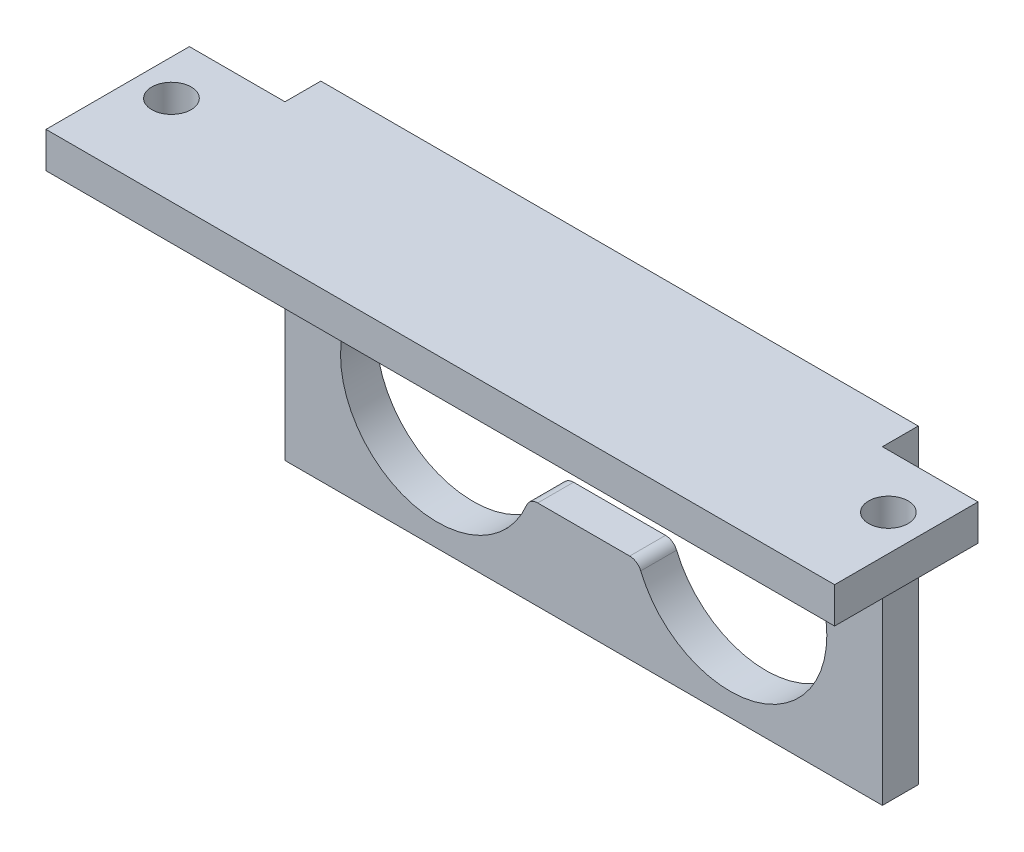
ISO-10303-21;
HEADER;
FILE_DESCRIPTION(('STEP AP214'),'2;1');
FILE_NAME('part.step','',(''),(''),'','','');
FILE_SCHEMA(('AUTOMOTIVE_DESIGN { 1 0 10303 214 1 1 1 1 }'));
ENDSEC;
DATA;
#1=APPLICATION_CONTEXT('core data for automotive mechanical design processes');
#2=APPLICATION_PROTOCOL_DEFINITION('international standard','automotive_design',2000,#1);
#3=PRODUCT_CONTEXT('',#1,'mechanical');
#4=PRODUCT('Part','Part','',(#3));
#5=PRODUCT_RELATED_PRODUCT_CATEGORY('part','',(#4));
#6=PRODUCT_DEFINITION_FORMATION('','',#4);
#7=PRODUCT_DEFINITION_CONTEXT('part definition',#1,'design');
#8=PRODUCT_DEFINITION('design','',#6,#7);
#9=PRODUCT_DEFINITION_SHAPE('','',#8);
#10=(LENGTH_UNIT() NAMED_UNIT(*) SI_UNIT(.MILLI.,.METRE.));
#11=(NAMED_UNIT(*) PLANE_ANGLE_UNIT() SI_UNIT($,.RADIAN.));
#12=(NAMED_UNIT(*) SI_UNIT($,.STERADIAN.) SOLID_ANGLE_UNIT());
#13=UNCERTAINTY_MEASURE_WITH_UNIT(LENGTH_MEASURE(1.E-05),#10,'distance_accuracy_value','');
#14=(GEOMETRIC_REPRESENTATION_CONTEXT(3) GLOBAL_UNCERTAINTY_ASSIGNED_CONTEXT((#13)) GLOBAL_UNIT_ASSIGNED_CONTEXT((#10,
#11,#12)) REPRESENTATION_CONTEXT('',''));
#15=CARTESIAN_POINT('',(0.,0.,0.));
#16=DIRECTION('',(0.,0.,1.));
#17=DIRECTION('',(1.,0.,0.));
#18=AXIS2_PLACEMENT_3D('',#15,#16,#17);
#19=CARTESIAN_POINT('',(25.,-10.,3.));
#20=DIRECTION('',(-1.,0.,0.));
#21=DIRECTION('',(0.,0.,1.));
#22=AXIS2_PLACEMENT_3D('',#19,#20,#21);
#23=PLANE('',#22);
#24=DIRECTION('',(0.,1.,0.));
#25=VECTOR('',#24,1.);
#26=CARTESIAN_POINT('',(25.,13.,3.));
#27=LINE('',#26,#25);
#28=CARTESIAN_POINT('',(25.,13.,3.));
#29=VERTEX_POINT('',#28);
#30=CARTESIAN_POINT('',(25.,16.,3.));
#31=VERTEX_POINT('',#30);
#32=EDGE_CURVE('E217',#29,#31,#27,.T.);
#33=ORIENTED_EDGE('',*,*,#32,.F.);
#34=DIRECTION('',(0.,1.,0.));
#35=VECTOR('',#34,1.);
#36=CARTESIAN_POINT('',(25.,-10.,3.));
#37=LINE('',#36,#35);
#38=CARTESIAN_POINT('',(25.,-10.,3.));
#39=VERTEX_POINT('',#38);
#40=EDGE_CURVE('E211',#39,#29,#37,.T.);
#41=ORIENTED_EDGE('',*,*,#40,.F.);
#42=DIRECTION('',(0.,0.,-1.));
#43=VECTOR('',#42,1.);
#44=CARTESIAN_POINT('',(25.,-10.,3.));
#45=LINE('',#44,#43);
#46=CARTESIAN_POINT('',(25.,-10.,0.));
#47=VERTEX_POINT('',#46);
#48=EDGE_CURVE('E43',#39,#47,#45,.T.);
#49=ORIENTED_EDGE('',*,*,#48,.T.);
#50=DIRECTION('',(0.,1.,0.));
#51=VECTOR('',#50,1.);
#52=CARTESIAN_POINT('',(25.,-10.,0.));
#53=LINE('',#52,#51);
#54=CARTESIAN_POINT('',(25.,16.,0.));
#55=VERTEX_POINT('',#54);
#56=EDGE_CURVE('E205',#47,#55,#53,.T.);
#57=ORIENTED_EDGE('',*,*,#56,.T.);
#58=DIRECTION('',(0.,0.,-1.));
#59=VECTOR('',#58,1.);
#60=CARTESIAN_POINT('',(25.,16.,0.));
#61=LINE('',#60,#59);
#62=EDGE_CURVE('E222',#31,#55,#61,.T.);
#63=ORIENTED_EDGE('',*,*,#62,.F.);
#64=EDGE_LOOP('',(#33,#41,#49,#57,#63));
#65=FACE_BOUND('',#64,.T.);
#66=ADVANCED_FACE('F35',(#65),#23,.F.);
#67=CARTESIAN_POINT('',(-25.,16.,15.));
#68=DIRECTION('',(0.,0.,-1.));
#69=DIRECTION('',(-1.,0.,0.));
#70=AXIS2_PLACEMENT_3D('',#67,#68,#69);
#71=PLANE('',#70);
#72=DIRECTION('',(-1.,0.,0.));
#73=VECTOR('',#72,1.);
#74=CARTESIAN_POINT('',(25.,13.,15.));
#75=LINE('',#74,#73);
#76=CARTESIAN_POINT('',(33.,13.,15.));
#77=VERTEX_POINT('',#76);
#78=CARTESIAN_POINT('',(-33.,13.,15.));
#79=VERTEX_POINT('',#78);
#80=EDGE_CURVE('E213',#77,#79,#75,.T.);
#81=ORIENTED_EDGE('',*,*,#80,.F.);
#82=DIRECTION('',(0.,1.,0.));
#83=VECTOR('',#82,1.);
#84=CARTESIAN_POINT('',(33.,13.,15.));
#85=LINE('',#84,#83);
#86=CARTESIAN_POINT('',(33.,16.,15.));
#87=VERTEX_POINT('',#86);
#88=EDGE_CURVE('E344',#77,#87,#85,.T.);
#89=ORIENTED_EDGE('',*,*,#88,.T.);
#90=DIRECTION('',(1.,0.,0.));
#91=VECTOR('',#90,1.);
#92=CARTESIAN_POINT('',(-25.,16.,15.));
#93=LINE('',#92,#91);
#94=CARTESIAN_POINT('',(-33.,16.,15.));
#95=VERTEX_POINT('',#94);
#96=EDGE_CURVE('E215',#95,#87,#93,.T.);
#97=ORIENTED_EDGE('',*,*,#96,.F.);
#98=DIRECTION('',(0.,1.,0.));
#99=VECTOR('',#98,1.);
#100=CARTESIAN_POINT('',(-33.,13.,15.));
#101=LINE('',#100,#99);
#102=EDGE_CURVE('E364',#79,#95,#101,.T.);
#103=ORIENTED_EDGE('',*,*,#102,.F.);
#104=EDGE_LOOP('',(#81,#89,#97,#103));
#105=FACE_BOUND('',#104,.T.);
#106=ADVANCED_FACE('F399',(#105),#71,.F.);
#107=CARTESIAN_POINT('',(0.,0.,3.));
#108=DIRECTION('',(0.,0.,1.));
#109=DIRECTION('',(1.,0.,0.));
#110=AXIS2_PLACEMENT_3D('',#107,#108,#109);
#111=PLANE('',#110);
#112=DIRECTION('',(0.,-1.,0.));
#113=VECTOR('',#112,1.);
#114=CARTESIAN_POINT('',(-25.,-10.,3.));
#115=LINE('',#114,#113);
#116=CARTESIAN_POINT('',(-25.,13.,3.));
#117=VERTEX_POINT('',#116);
#118=CARTESIAN_POINT('',(-25.,-10.,3.));
#119=VERTEX_POINT('',#118);
#120=EDGE_CURVE('E201',#117,#119,#115,.T.);
#121=ORIENTED_EDGE('',*,*,#120,.T.);
#122=DIRECTION('',(1.,0.,0.));
#123=VECTOR('',#122,1.);
#124=CARTESIAN_POINT('',(25.,-10.,3.));
#125=LINE('',#124,#123);
#126=EDGE_CURVE('E204',#119,#39,#125,.T.);
#127=ORIENTED_EDGE('',*,*,#126,.T.);
#128=ORIENTED_EDGE('',*,*,#40,.T.);
#129=DIRECTION('',(1.,0.,0.));
#130=VECTOR('',#129,1.);
#131=CARTESIAN_POINT('',(25.,13.,3.));
#132=LINE('',#131,#130);
#133=EDGE_CURVE('E194',#117,#29,#132,.T.);
#134=ORIENTED_EDGE('',*,*,#133,.F.);
#135=EDGE_LOOP('',(#121,#127,#128,#134));
#136=FACE_BOUND('',#135,.T.);
#137=CARTESIAN_POINT('',(12.25,0.,3.));
#138=DIRECTION('',(0.,0.,1.));
#139=DIRECTION('',(1.,0.,0.));
#140=AXIS2_PLACEMENT_3D('',#137,#138,#139);
#141=CIRCLE('',#140,8.1);
#142=CARTESIAN_POINT('',(4.77307692307692,-3.11538461538461,3.));
#143=VERTEX_POINT('',#142);
#144=CARTESIAN_POINT('',(4.77307692307692,3.11538461538462,3.));
#145=VERTEX_POINT('',#144);
#146=EDGE_CURVE('E259',#143,#145,#141,.T.);
#147=ORIENTED_EDGE('',*,*,#146,.F.);
#148=CARTESIAN_POINT('',(3.85,-3.5,3.));
#149=DIRECTION('',(0.,0.,-1.));
#150=DIRECTION('',(-1.,0.,0.));
#151=AXIS2_PLACEMENT_3D('',#148,#149,#150);
#152=CIRCLE('',#151,1.);
#153=CARTESIAN_POINT('',(3.85,-2.5,3.));
#154=VERTEX_POINT('',#153);
#155=EDGE_CURVE('E257',#154,#143,#152,.T.);
#156=ORIENTED_EDGE('',*,*,#155,.F.);
#157=DIRECTION('',(1.,0.,0.));
#158=VECTOR('',#157,1.);
#159=CARTESIAN_POINT('',(3.85,-2.5,3.));
#160=LINE('',#159,#158);
#161=CARTESIAN_POINT('',(-3.85,-2.5,3.));
#162=VERTEX_POINT('',#161);
#163=EDGE_CURVE('E273',#162,#154,#160,.T.);
#164=ORIENTED_EDGE('',*,*,#163,.F.);
#165=CARTESIAN_POINT('',(-3.85,-3.5,3.));
#166=DIRECTION('',(0.,0.,-1.));
#167=DIRECTION('',(1.,0.,0.));
#168=AXIS2_PLACEMENT_3D('',#165,#166,#167);
#169=CIRCLE('',#168,1.);
#170=CARTESIAN_POINT('',(-4.77307692307692,-3.11538461538462,3.));
#171=VERTEX_POINT('',#170);
#172=EDGE_CURVE('E270',#171,#162,#169,.T.);
#173=ORIENTED_EDGE('',*,*,#172,.F.);
#174=CARTESIAN_POINT('',(-12.25,0.,3.));
#175=DIRECTION('',(0.,0.,1.));
#176=DIRECTION('',(1.,0.,0.));
#177=AXIS2_PLACEMENT_3D('',#174,#175,#176);
#178=CIRCLE('',#177,8.1);
#179=CARTESIAN_POINT('',(-4.77307692307692,3.11538461538461,3.));
#180=VERTEX_POINT('',#179);
#181=EDGE_CURVE('E268',#180,#171,#178,.T.);
#182=ORIENTED_EDGE('',*,*,#181,.F.);
#183=CARTESIAN_POINT('',(-3.85,3.5,3.));
#184=DIRECTION('',(0.,0.,-1.));
#185=DIRECTION('',(-1.,0.,0.));
#186=AXIS2_PLACEMENT_3D('',#183,#184,#185);
#187=CIRCLE('',#186,1.);
#188=CARTESIAN_POINT('',(-3.85,2.5,3.));
#189=VERTEX_POINT('',#188);
#190=EDGE_CURVE('E266',#189,#180,#187,.T.);
#191=ORIENTED_EDGE('',*,*,#190,.F.);
#192=DIRECTION('',(-1.,0.,0.));
#193=VECTOR('',#192,1.);
#194=CARTESIAN_POINT('',(-3.85,2.5,3.));
#195=LINE('',#194,#193);
#196=CARTESIAN_POINT('',(3.85,2.5,3.));
#197=VERTEX_POINT('',#196);
#198=EDGE_CURVE('E264',#197,#189,#195,.T.);
#199=ORIENTED_EDGE('',*,*,#198,.F.);
#200=CARTESIAN_POINT('',(3.85,3.5,3.));
#201=DIRECTION('',(0.,0.,-1.));
#202=DIRECTION('',(1.,0.,0.));
#203=AXIS2_PLACEMENT_3D('',#200,#201,#202);
#204=CIRCLE('',#203,1.);
#205=EDGE_CURVE('E262',#145,#197,#204,.T.);
#206=ORIENTED_EDGE('',*,*,#205,.F.);
#207=EDGE_LOOP('',(#147,#156,#164,#173,#182,#191,#199,#206));
#208=FACE_BOUND('',#207,.T.);
#209=DIRECTION('',(-1.,0.,0.));
#210=VECTOR('',#209,1.);
#211=CARTESIAN_POINT('',(3.25,9.,3.));
#212=LINE('',#211,#210);
#213=CARTESIAN_POINT('',(3.25,9.,3.));
#214=VERTEX_POINT('',#213);
#215=CARTESIAN_POINT('',(-3.25,9.,3.));
#216=VERTEX_POINT('',#215);
#217=EDGE_CURVE('E230',#214,#216,#212,.T.);
#218=ORIENTED_EDGE('',*,*,#217,.F.);
#219=CARTESIAN_POINT('',(3.25,7.25,3.));
#220=DIRECTION('',(0.,0.,1.));
#221=DIRECTION('',(1.,0.,0.));
#222=AXIS2_PLACEMENT_3D('',#219,#220,#221);
#223=CIRCLE('',#222,1.75);
#224=CARTESIAN_POINT('',(3.25,5.5,3.));
#225=VERTEX_POINT('',#224);
#226=EDGE_CURVE('E228',#225,#214,#223,.T.);
#227=ORIENTED_EDGE('',*,*,#226,.F.);
#228=DIRECTION('',(1.,0.,0.));
#229=VECTOR('',#228,1.);
#230=CARTESIAN_POINT('',(3.25,5.5,3.));
#231=LINE('',#230,#229);
#232=CARTESIAN_POINT('',(-3.25,5.5,3.));
#233=VERTEX_POINT('',#232);
#234=EDGE_CURVE('E235',#233,#225,#231,.T.);
#235=ORIENTED_EDGE('',*,*,#234,.F.);
#236=CARTESIAN_POINT('',(-3.25,7.25,3.));
#237=DIRECTION('',(0.,0.,1.));
#238=DIRECTION('',(1.,0.,0.));
#239=AXIS2_PLACEMENT_3D('',#236,#237,#238);
#240=CIRCLE('',#239,1.75);
#241=EDGE_CURVE('E233',#216,#233,#240,.T.);
#242=ORIENTED_EDGE('',*,*,#241,.F.);
#243=EDGE_LOOP('',(#218,#227,#235,#242));
#244=FACE_BOUND('',#243,.T.);
#245=ADVANCED_FACE('F208',(#136,#208,#244),#111,.T.);
#246=CARTESIAN_POINT('',(0.,0.,0.));
#247=DIRECTION('',(0.,0.,1.));
#248=DIRECTION('',(1.,0.,0.));
#249=AXIS2_PLACEMENT_3D('',#246,#247,#248);
#250=PLANE('',#249);
#251=CARTESIAN_POINT('',(3.85,-3.5,0.));
#252=DIRECTION('',(0.,0.,-1.));
#253=DIRECTION('',(-1.,0.,0.));
#254=AXIS2_PLACEMENT_3D('',#251,#252,#253);
#255=CIRCLE('',#254,1.);
#256=CARTESIAN_POINT('',(3.85,-2.5,0.));
#257=VERTEX_POINT('',#256);
#258=CARTESIAN_POINT('',(4.77307692307692,-3.11538461538461,0.));
#259=VERTEX_POINT('',#258);
#260=EDGE_CURVE('E256',#257,#259,#255,.T.);
#261=ORIENTED_EDGE('',*,*,#260,.T.);
#262=CARTESIAN_POINT('',(12.25,0.,0.));
#263=DIRECTION('',(0.,0.,1.));
#264=DIRECTION('',(1.,0.,0.));
#265=AXIS2_PLACEMENT_3D('',#262,#263,#264);
#266=CIRCLE('',#265,8.1);
#267=CARTESIAN_POINT('',(4.77307692307692,3.11538461538462,0.));
#268=VERTEX_POINT('',#267);
#269=EDGE_CURVE('E278',#259,#268,#266,.T.);
#270=ORIENTED_EDGE('',*,*,#269,.T.);
#271=CARTESIAN_POINT('',(3.85,3.5,0.));
#272=DIRECTION('',(0.,0.,-1.));
#273=DIRECTION('',(1.,0.,0.));
#274=AXIS2_PLACEMENT_3D('',#271,#272,#273);
#275=CIRCLE('',#274,1.);
#276=CARTESIAN_POINT('',(3.85,2.5,0.));
#277=VERTEX_POINT('',#276);
#278=EDGE_CURVE('E281',#268,#277,#275,.T.);
#279=ORIENTED_EDGE('',*,*,#278,.T.);
#280=DIRECTION('',(-1.,0.,0.));
#281=VECTOR('',#280,1.);
#282=CARTESIAN_POINT('',(-3.85,2.5,0.));
#283=LINE('',#282,#281);
#284=CARTESIAN_POINT('',(-3.85,2.5,0.));
#285=VERTEX_POINT('',#284);
#286=EDGE_CURVE('E284',#277,#285,#283,.T.);
#287=ORIENTED_EDGE('',*,*,#286,.T.);
#288=CARTESIAN_POINT('',(-3.85,3.5,0.));
#289=DIRECTION('',(0.,0.,-1.));
#290=DIRECTION('',(-1.,0.,0.));
#291=AXIS2_PLACEMENT_3D('',#288,#289,#290);
#292=CIRCLE('',#291,1.);
#293=CARTESIAN_POINT('',(-4.77307692307692,3.11538461538461,0.));
#294=VERTEX_POINT('',#293);
#295=EDGE_CURVE('E287',#285,#294,#292,.T.);
#296=ORIENTED_EDGE('',*,*,#295,.T.);
#297=CARTESIAN_POINT('',(-12.25,0.,0.));
#298=DIRECTION('',(0.,0.,1.));
#299=DIRECTION('',(1.,0.,0.));
#300=AXIS2_PLACEMENT_3D('',#297,#298,#299);
#301=CIRCLE('',#300,8.1);
#302=CARTESIAN_POINT('',(-4.77307692307692,-3.11538461538462,0.));
#303=VERTEX_POINT('',#302);
#304=EDGE_CURVE('E290',#294,#303,#301,.T.);
#305=ORIENTED_EDGE('',*,*,#304,.T.);
#306=CARTESIAN_POINT('',(-3.85,-3.5,0.));
#307=DIRECTION('',(0.,0.,-1.));
#308=DIRECTION('',(1.,0.,0.));
#309=AXIS2_PLACEMENT_3D('',#306,#307,#308);
#310=CIRCLE('',#309,1.);
#311=CARTESIAN_POINT('',(-3.85,-2.5,0.));
#312=VERTEX_POINT('',#311);
#313=EDGE_CURVE('E293',#303,#312,#310,.T.);
#314=ORIENTED_EDGE('',*,*,#313,.T.);
#315=DIRECTION('',(1.,0.,0.));
#316=VECTOR('',#315,1.);
#317=CARTESIAN_POINT('',(3.85,-2.5,0.));
#318=LINE('',#317,#316);
#319=EDGE_CURVE('E260',#312,#257,#318,.T.);
#320=ORIENTED_EDGE('',*,*,#319,.T.);
#321=EDGE_LOOP('',(#261,#270,#279,#287,#296,#305,#314,#320));
#322=FACE_BOUND('',#321,.T.);
#323=DIRECTION('',(0.,-1.,0.));
#324=VECTOR('',#323,1.);
#325=CARTESIAN_POINT('',(-25.,-10.,0.));
#326=LINE('',#325,#324);
#327=CARTESIAN_POINT('',(-25.,16.,0.));
#328=VERTEX_POINT('',#327);
#329=CARTESIAN_POINT('',(-25.,-10.,0.));
#330=VERTEX_POINT('',#329);
#331=EDGE_CURVE('E314',#328,#330,#326,.T.);
#332=ORIENTED_EDGE('',*,*,#331,.F.);
#333=DIRECTION('',(-1.,0.,0.));
#334=VECTOR('',#333,1.);
#335=CARTESIAN_POINT('',(-25.,16.,0.));
#336=LINE('',#335,#334);
#337=EDGE_CURVE('E224',#55,#328,#336,.T.);
#338=ORIENTED_EDGE('',*,*,#337,.F.);
#339=ORIENTED_EDGE('',*,*,#56,.F.);
#340=DIRECTION('',(1.,0.,0.));
#341=VECTOR('',#340,1.);
#342=CARTESIAN_POINT('',(25.,-10.,0.));
#343=LINE('',#342,#341);
#344=EDGE_CURVE('E319',#330,#47,#343,.T.);
#345=ORIENTED_EDGE('',*,*,#344,.F.);
#346=EDGE_LOOP('',(#332,#338,#339,#345));
#347=FACE_BOUND('',#346,.T.);
#348=CARTESIAN_POINT('',(3.25,7.25,0.));
#349=DIRECTION('',(0.,0.,1.));
#350=DIRECTION('',(1.,0.,0.));
#351=AXIS2_PLACEMENT_3D('',#348,#349,#350);
#352=CIRCLE('',#351,1.75);
#353=CARTESIAN_POINT('',(3.25,5.5,0.));
#354=VERTEX_POINT('',#353);
#355=CARTESIAN_POINT('',(3.25,9.,0.));
#356=VERTEX_POINT('',#355);
#357=EDGE_CURVE('E227',#354,#356,#352,.T.);
#358=ORIENTED_EDGE('',*,*,#357,.T.);
#359=DIRECTION('',(-1.,0.,0.));
#360=VECTOR('',#359,1.);
#361=CARTESIAN_POINT('',(3.25,9.,0.));
#362=LINE('',#361,#360);
#363=CARTESIAN_POINT('',(-3.25,9.,0.));
#364=VERTEX_POINT('',#363);
#365=EDGE_CURVE('E240',#356,#364,#362,.T.);
#366=ORIENTED_EDGE('',*,*,#365,.T.);
#367=CARTESIAN_POINT('',(-3.25,7.25,0.));
#368=DIRECTION('',(0.,0.,1.));
#369=DIRECTION('',(1.,0.,0.));
#370=AXIS2_PLACEMENT_3D('',#367,#368,#369);
#371=CIRCLE('',#370,1.75);
#372=CARTESIAN_POINT('',(-3.25,5.5,0.));
#373=VERTEX_POINT('',#372);
#374=EDGE_CURVE('E243',#364,#373,#371,.T.);
#375=ORIENTED_EDGE('',*,*,#374,.T.);
#376=DIRECTION('',(1.,0.,0.));
#377=VECTOR('',#376,1.);
#378=CARTESIAN_POINT('',(3.25,5.5,0.));
#379=LINE('',#378,#377);
#380=EDGE_CURVE('E231',#373,#354,#379,.T.);
#381=ORIENTED_EDGE('',*,*,#380,.T.);
#382=EDGE_LOOP('',(#358,#366,#375,#381));
#383=FACE_BOUND('',#382,.T.);
#384=ADVANCED_FACE('F329',(#322,#347,#383),#250,.F.);
#385=CARTESIAN_POINT('',(-25.,-10.,3.));
#386=DIRECTION('',(1.,0.,0.));
#387=DIRECTION('',(0.,0.,-1.));
#388=AXIS2_PLACEMENT_3D('',#385,#386,#387);
#389=PLANE('',#388);
#390=ORIENTED_EDGE('',*,*,#120,.F.);
#391=DIRECTION('',(0.,1.,0.));
#392=VECTOR('',#391,1.);
#393=CARTESIAN_POINT('',(-25.,13.,3.));
#394=LINE('',#393,#392);
#395=CARTESIAN_POINT('',(-25.,16.,3.));
#396=VERTEX_POINT('',#395);
#397=EDGE_CURVE('E176',#117,#396,#394,.T.);
#398=ORIENTED_EDGE('',*,*,#397,.T.);
#399=DIRECTION('',(0.,0.,1.));
#400=VECTOR('',#399,1.);
#401=CARTESIAN_POINT('',(-25.,16.,0.));
#402=LINE('',#401,#400);
#403=EDGE_CURVE('E212',#328,#396,#402,.T.);
#404=ORIENTED_EDGE('',*,*,#403,.F.);
#405=ORIENTED_EDGE('',*,*,#331,.T.);
#406=DIRECTION('',(0.,0.,-1.));
#407=VECTOR('',#406,1.);
#408=CARTESIAN_POINT('',(-25.,-10.,3.));
#409=LINE('',#408,#407);
#410=EDGE_CURVE('E11',#119,#330,#409,.T.);
#411=ORIENTED_EDGE('',*,*,#410,.F.);
#412=EDGE_LOOP('',(#390,#398,#404,#405,#411));
#413=FACE_BOUND('',#412,.T.);
#414=ADVANCED_FACE('F37',(#413),#389,.F.);
#415=CARTESIAN_POINT('',(25.,-10.,3.));
#416=DIRECTION('',(0.,1.,0.));
#417=DIRECTION('',(-1.,0.,0.));
#418=AXIS2_PLACEMENT_3D('',#415,#416,#417);
#419=PLANE('',#418);
#420=ORIENTED_EDGE('',*,*,#344,.T.);
#421=ORIENTED_EDGE('',*,*,#48,.F.);
#422=ORIENTED_EDGE('',*,*,#126,.F.);
#423=ORIENTED_EDGE('',*,*,#410,.T.);
#424=EDGE_LOOP('',(#420,#421,#422,#423));
#425=FACE_BOUND('',#424,.T.);
#426=ADVANCED_FACE('F406',(#425),#419,.F.);
#427=CARTESIAN_POINT('',(3.85,-3.5,3.));
#428=DIRECTION('',(0.,0.,-1.));
#429=DIRECTION('',(-1.,0.,0.));
#430=AXIS2_PLACEMENT_3D('',#427,#428,#429);
#431=CYLINDRICAL_SURFACE('',#430,1.);
#432=ORIENTED_EDGE('',*,*,#260,.F.);
#433=DIRECTION('',(0.,0.,-1.));
#434=VECTOR('',#433,1.);
#435=CARTESIAN_POINT('',(3.85,-2.5,3.));
#436=LINE('',#435,#434);
#437=EDGE_CURVE('E275',#154,#257,#436,.T.);
#438=ORIENTED_EDGE('',*,*,#437,.F.);
#439=ORIENTED_EDGE('',*,*,#155,.T.);
#440=DIRECTION('',(0.,0.,-1.));
#441=VECTOR('',#440,1.);
#442=CARTESIAN_POINT('',(4.77307692307692,-3.11538461538461,3.));
#443=LINE('',#442,#441);
#444=EDGE_CURVE('E312',#143,#259,#443,.T.);
#445=ORIENTED_EDGE('',*,*,#444,.T.);
#446=EDGE_LOOP('',(#432,#438,#439,#445));
#447=FACE_BOUND('',#446,.T.);
#448=ADVANCED_FACE('F408',(#447),#431,.T.);
#449=CARTESIAN_POINT('',(12.25,0.,3.));
#450=DIRECTION('',(0.,0.,-1.));
#451=DIRECTION('',(-1.,0.,0.));
#452=AXIS2_PLACEMENT_3D('',#449,#450,#451);
#453=CYLINDRICAL_SURFACE('',#452,8.1);
#454=ORIENTED_EDGE('',*,*,#269,.F.);
#455=ORIENTED_EDGE('',*,*,#444,.F.);
#456=ORIENTED_EDGE('',*,*,#146,.T.);
#457=DIRECTION('',(0.,0.,-1.));
#458=VECTOR('',#457,1.);
#459=CARTESIAN_POINT('',(4.77307692307692,3.11538461538462,3.));
#460=LINE('',#459,#458);
#461=EDGE_CURVE('E310',#145,#268,#460,.T.);
#462=ORIENTED_EDGE('',*,*,#461,.T.);
#463=EDGE_LOOP('',(#454,#455,#456,#462));
#464=FACE_BOUND('',#463,.T.);
#465=ADVANCED_FACE('F413',(#464),#453,.F.);
#466=CARTESIAN_POINT('',(3.85,3.5,3.));
#467=DIRECTION('',(0.,0.,-1.));
#468=DIRECTION('',(-1.,0.,0.));
#469=AXIS2_PLACEMENT_3D('',#466,#467,#468);
#470=CYLINDRICAL_SURFACE('',#469,1.);
#471=ORIENTED_EDGE('',*,*,#278,.F.);
#472=ORIENTED_EDGE('',*,*,#461,.F.);
#473=ORIENTED_EDGE('',*,*,#205,.T.);
#474=DIRECTION('',(0.,0.,-1.));
#475=VECTOR('',#474,1.);
#476=CARTESIAN_POINT('',(3.85,2.5,3.));
#477=LINE('',#476,#475);
#478=EDGE_CURVE('E308',#197,#277,#477,.T.);
#479=ORIENTED_EDGE('',*,*,#478,.T.);
#480=EDGE_LOOP('',(#471,#472,#473,#479));
#481=FACE_BOUND('',#480,.T.);
#482=ADVANCED_FACE('F439',(#481),#470,.T.);
#483=CARTESIAN_POINT('',(-3.85,2.5,3.));
#484=DIRECTION('',(0.,-1.,0.));
#485=DIRECTION('',(0.,0.,-1.));
#486=AXIS2_PLACEMENT_3D('',#483,#484,#485);
#487=PLANE('',#486);
#488=ORIENTED_EDGE('',*,*,#286,.F.);
#489=ORIENTED_EDGE('',*,*,#478,.F.);
#490=ORIENTED_EDGE('',*,*,#198,.T.);
#491=DIRECTION('',(0.,0.,-1.));
#492=VECTOR('',#491,1.);
#493=CARTESIAN_POINT('',(-3.85,2.5,3.));
#494=LINE('',#493,#492);
#495=EDGE_CURVE('E306',#189,#285,#494,.T.);
#496=ORIENTED_EDGE('',*,*,#495,.T.);
#497=EDGE_LOOP('',(#488,#489,#490,#496));
#498=FACE_BOUND('',#497,.T.);
#499=ADVANCED_FACE('F444',(#498),#487,.T.);
#500=CARTESIAN_POINT('',(-3.85,3.5,3.));
#501=DIRECTION('',(0.,0.,-1.));
#502=DIRECTION('',(-1.,0.,0.));
#503=AXIS2_PLACEMENT_3D('',#500,#501,#502);
#504=CYLINDRICAL_SURFACE('',#503,1.);
#505=ORIENTED_EDGE('',*,*,#295,.F.);
#506=ORIENTED_EDGE('',*,*,#495,.F.);
#507=ORIENTED_EDGE('',*,*,#190,.T.);
#508=DIRECTION('',(0.,0.,-1.));
#509=VECTOR('',#508,1.);
#510=CARTESIAN_POINT('',(-4.77307692307692,3.11538461538461,3.));
#511=LINE('',#510,#509);
#512=EDGE_CURVE('E304',#180,#294,#511,.T.);
#513=ORIENTED_EDGE('',*,*,#512,.T.);
#514=EDGE_LOOP('',(#505,#506,#507,#513));
#515=FACE_BOUND('',#514,.T.);
#516=ADVANCED_FACE('F449',(#515),#504,.T.);
#517=CARTESIAN_POINT('',(-12.25,0.,3.));
#518=DIRECTION('',(0.,0.,-1.));
#519=DIRECTION('',(-1.,0.,0.));
#520=AXIS2_PLACEMENT_3D('',#517,#518,#519);
#521=CYLINDRICAL_SURFACE('',#520,8.1);
#522=ORIENTED_EDGE('',*,*,#304,.F.);
#523=ORIENTED_EDGE('',*,*,#512,.F.);
#524=ORIENTED_EDGE('',*,*,#181,.T.);
#525=DIRECTION('',(0.,0.,-1.));
#526=VECTOR('',#525,1.);
#527=CARTESIAN_POINT('',(-4.77307692307692,-3.11538461538462,3.));
#528=LINE('',#527,#526);
#529=EDGE_CURVE('E302',#171,#303,#528,.T.);
#530=ORIENTED_EDGE('',*,*,#529,.T.);
#531=EDGE_LOOP('',(#522,#523,#524,#530));
#532=FACE_BOUND('',#531,.T.);
#533=ADVANCED_FACE('F453',(#532),#521,.F.);
#534=CARTESIAN_POINT('',(-3.85,-3.5,3.));
#535=DIRECTION('',(0.,0.,-1.));
#536=DIRECTION('',(-1.,0.,0.));
#537=AXIS2_PLACEMENT_3D('',#534,#535,#536);
#538=CYLINDRICAL_SURFACE('',#537,1.);
#539=ORIENTED_EDGE('',*,*,#313,.F.);
#540=ORIENTED_EDGE('',*,*,#529,.F.);
#541=ORIENTED_EDGE('',*,*,#172,.T.);
#542=DIRECTION('',(0.,0.,-1.));
#543=VECTOR('',#542,1.);
#544=CARTESIAN_POINT('',(-3.85,-2.5,3.));
#545=LINE('',#544,#543);
#546=EDGE_CURVE('E300',#162,#312,#545,.T.);
#547=ORIENTED_EDGE('',*,*,#546,.T.);
#548=EDGE_LOOP('',(#539,#540,#541,#547));
#549=FACE_BOUND('',#548,.T.);
#550=ADVANCED_FACE('F457',(#549),#538,.T.);
#551=CARTESIAN_POINT('',(3.85,-2.5,3.));
#552=DIRECTION('',(0.,1.,0.));
#553=DIRECTION('',(-1.,0.,0.));
#554=AXIS2_PLACEMENT_3D('',#551,#552,#553);
#555=PLANE('',#554);
#556=ORIENTED_EDGE('',*,*,#319,.F.);
#557=ORIENTED_EDGE('',*,*,#546,.F.);
#558=ORIENTED_EDGE('',*,*,#163,.T.);
#559=ORIENTED_EDGE('',*,*,#437,.T.);
#560=EDGE_LOOP('',(#556,#557,#558,#559));
#561=FACE_BOUND('',#560,.T.);
#562=ADVANCED_FACE('F428',(#561),#555,.T.);
#563=CARTESIAN_POINT('',(3.25,7.25,3.));
#564=DIRECTION('',(0.,0.,-1.));
#565=DIRECTION('',(-1.,0.,0.));
#566=AXIS2_PLACEMENT_3D('',#563,#564,#565);
#567=CYLINDRICAL_SURFACE('',#566,1.75);
#568=ORIENTED_EDGE('',*,*,#357,.F.);
#569=DIRECTION('',(0.,0.,-1.));
#570=VECTOR('',#569,1.);
#571=CARTESIAN_POINT('',(3.25,5.5,3.));
#572=LINE('',#571,#570);
#573=EDGE_CURVE('E237',#225,#354,#572,.T.);
#574=ORIENTED_EDGE('',*,*,#573,.F.);
#575=ORIENTED_EDGE('',*,*,#226,.T.);
#576=DIRECTION('',(0.,0.,-1.));
#577=VECTOR('',#576,1.);
#578=CARTESIAN_POINT('',(3.25,9.,3.));
#579=LINE('',#578,#577);
#580=EDGE_CURVE('E253',#214,#356,#579,.T.);
#581=ORIENTED_EDGE('',*,*,#580,.T.);
#582=EDGE_LOOP('',(#568,#574,#575,#581));
#583=FACE_BOUND('',#582,.T.);
#584=ADVANCED_FACE('F464',(#583),#567,.F.);
#585=CARTESIAN_POINT('',(3.25,9.,3.));
#586=DIRECTION('',(0.,-1.,0.));
#587=DIRECTION('',(1.,0.,0.));
#588=AXIS2_PLACEMENT_3D('',#585,#586,#587);
#589=PLANE('',#588);
#590=ORIENTED_EDGE('',*,*,#365,.F.);
#591=ORIENTED_EDGE('',*,*,#580,.F.);
#592=ORIENTED_EDGE('',*,*,#217,.T.);
#593=DIRECTION('',(0.,0.,-1.));
#594=VECTOR('',#593,1.);
#595=CARTESIAN_POINT('',(-3.25,9.,3.));
#596=LINE('',#595,#594);
#597=EDGE_CURVE('E251',#216,#364,#596,.T.);
#598=ORIENTED_EDGE('',*,*,#597,.T.);
#599=EDGE_LOOP('',(#590,#591,#592,#598));
#600=FACE_BOUND('',#599,.T.);
#601=ADVANCED_FACE('F515',(#600),#589,.T.);
#602=CARTESIAN_POINT('',(-3.25,7.25,3.));
#603=DIRECTION('',(0.,0.,-1.));
#604=DIRECTION('',(-1.,0.,0.));
#605=AXIS2_PLACEMENT_3D('',#602,#603,#604);
#606=CYLINDRICAL_SURFACE('',#605,1.75);
#607=ORIENTED_EDGE('',*,*,#374,.F.);
#608=ORIENTED_EDGE('',*,*,#597,.F.);
#609=ORIENTED_EDGE('',*,*,#241,.T.);
#610=DIRECTION('',(0.,0.,-1.));
#611=VECTOR('',#610,1.);
#612=CARTESIAN_POINT('',(-3.25,5.5,3.));
#613=LINE('',#612,#611);
#614=EDGE_CURVE('E58',#233,#373,#613,.T.);
#615=ORIENTED_EDGE('',*,*,#614,.T.);
#616=EDGE_LOOP('',(#607,#608,#609,#615));
#617=FACE_BOUND('',#616,.T.);
#618=ADVANCED_FACE('F395',(#617),#606,.F.);
#619=CARTESIAN_POINT('',(3.25,5.5,3.));
#620=DIRECTION('',(0.,1.,0.));
#621=DIRECTION('',(0.,0.,1.));
#622=AXIS2_PLACEMENT_3D('',#619,#620,#621);
#623=PLANE('',#622);
#624=ORIENTED_EDGE('',*,*,#380,.F.);
#625=ORIENTED_EDGE('',*,*,#614,.F.);
#626=ORIENTED_EDGE('',*,*,#234,.T.);
#627=ORIENTED_EDGE('',*,*,#573,.T.);
#628=EDGE_LOOP('',(#624,#625,#626,#627));
#629=FACE_BOUND('',#628,.T.);
#630=ADVANCED_FACE('F388',(#629),#623,.T.);
#631=CARTESIAN_POINT('',(0.,16.,0.));
#632=DIRECTION('',(0.,1.,0.));
#633=DIRECTION('',(-1.,0.,0.));
#634=AXIS2_PLACEMENT_3D('',#631,#632,#633);
#635=PLANE('',#634);
#636=ORIENTED_EDGE('',*,*,#403,.T.);
#637=DIRECTION('',(-1.,0.,0.));
#638=VECTOR('',#637,1.);
#639=CARTESIAN_POINT('',(-25.,16.,3.));
#640=LINE('',#639,#638);
#641=CARTESIAN_POINT('',(-33.,16.,3.));
#642=VERTEX_POINT('',#641);
#643=EDGE_CURVE('E50',#396,#642,#640,.T.);
#644=ORIENTED_EDGE('',*,*,#643,.T.);
#645=DIRECTION('',(0.,0.,1.));
#646=VECTOR('',#645,1.);
#647=CARTESIAN_POINT('',(-33.,16.,15.));
#648=LINE('',#647,#646);
#649=EDGE_CURVE('E197',#642,#95,#648,.T.);
#650=ORIENTED_EDGE('',*,*,#649,.T.);
#651=ORIENTED_EDGE('',*,*,#96,.T.);
#652=DIRECTION('',(0.,0.,-1.));
#653=VECTOR('',#652,1.);
#654=CARTESIAN_POINT('',(33.,16.,15.));
#655=LINE('',#654,#653);
#656=CARTESIAN_POINT('',(33.,16.,3.));
#657=VERTEX_POINT('',#656);
#658=EDGE_CURVE('E357',#87,#657,#655,.T.);
#659=ORIENTED_EDGE('',*,*,#658,.T.);
#660=DIRECTION('',(-1.,0.,0.));
#661=VECTOR('',#660,1.);
#662=CARTESIAN_POINT('',(25.,16.,3.));
#663=LINE('',#662,#661);
#664=EDGE_CURVE('E337',#657,#31,#663,.T.);
#665=ORIENTED_EDGE('',*,*,#664,.T.);
#666=ORIENTED_EDGE('',*,*,#62,.T.);
#667=ORIENTED_EDGE('',*,*,#337,.T.);
#668=EDGE_LOOP('',(#636,#644,#650,#651,#659,#665,#666,#667));
#669=FACE_BOUND('',#668,.T.);
#670=CARTESIAN_POINT('',(30.,16.,7.5));
#671=DIRECTION('',(0.,1.,0.));
#672=DIRECTION('',(-1.,0.,0.));
#673=AXIS2_PLACEMENT_3D('',#670,#671,#672);
#674=CIRCLE('',#673,1.65000000000001);
#675=CARTESIAN_POINT('',(28.35,16.,7.5));
#676=VERTEX_POINT('',#675);
#677=EDGE_CURVE('E360',#676,#676,#674,.T.);
#678=ORIENTED_EDGE('',*,*,#677,.F.);
#679=EDGE_LOOP('',(#678));
#680=FACE_BOUND('',#679,.T.);
#681=CARTESIAN_POINT('',(-30.,16.,7.5));
#682=DIRECTION('',(0.,1.,0.));
#683=DIRECTION('',(-1.,0.,0.));
#684=AXIS2_PLACEMENT_3D('',#681,#682,#683);
#685=CIRCLE('',#684,1.65);
#686=CARTESIAN_POINT('',(-31.65,16.,7.5));
#687=VERTEX_POINT('',#686);
#688=EDGE_CURVE('E374',#687,#687,#685,.T.);
#689=ORIENTED_EDGE('',*,*,#688,.F.);
#690=EDGE_LOOP('',(#689));
#691=FACE_BOUND('',#690,.T.);
#692=ADVANCED_FACE('F332',(#669,#680,#691),#635,.T.);
#693=CARTESIAN_POINT('',(0.,13.,0.));
#694=DIRECTION('',(0.,-1.,0.));
#695=DIRECTION('',(1.,0.,0.));
#696=AXIS2_PLACEMENT_3D('',#693,#694,#695);
#697=PLANE('',#696);
#698=ORIENTED_EDGE('',*,*,#133,.T.);
#699=DIRECTION('',(-1.,0.,0.));
#700=VECTOR('',#699,1.);
#701=CARTESIAN_POINT('',(25.,13.,3.));
#702=LINE('',#701,#700);
#703=CARTESIAN_POINT('',(33.,13.,3.));
#704=VERTEX_POINT('',#703);
#705=EDGE_CURVE('E341',#704,#29,#702,.T.);
#706=ORIENTED_EDGE('',*,*,#705,.F.);
#707=DIRECTION('',(0.,0.,-1.));
#708=VECTOR('',#707,1.);
#709=CARTESIAN_POINT('',(33.,13.,15.));
#710=LINE('',#709,#708);
#711=EDGE_CURVE('E352',#77,#704,#710,.T.);
#712=ORIENTED_EDGE('',*,*,#711,.F.);
#713=ORIENTED_EDGE('',*,*,#80,.T.);
#714=DIRECTION('',(0.,0.,1.));
#715=VECTOR('',#714,1.);
#716=CARTESIAN_POINT('',(-33.,13.,15.));
#717=LINE('',#716,#715);
#718=CARTESIAN_POINT('',(-33.,13.,3.));
#719=VERTEX_POINT('',#718);
#720=EDGE_CURVE('E185',#719,#79,#717,.T.);
#721=ORIENTED_EDGE('',*,*,#720,.F.);
#722=DIRECTION('',(-1.,0.,0.));
#723=VECTOR('',#722,1.);
#724=CARTESIAN_POINT('',(-25.,13.,3.));
#725=LINE('',#724,#723);
#726=EDGE_CURVE('E179',#117,#719,#725,.T.);
#727=ORIENTED_EDGE('',*,*,#726,.F.);
#728=EDGE_LOOP('',(#698,#706,#712,#713,#721,#727));
#729=FACE_BOUND('',#728,.T.);
#730=CARTESIAN_POINT('',(30.,13.,7.5));
#731=DIRECTION('',(0.,1.,0.));
#732=DIRECTION('',(-1.,0.,0.));
#733=AXIS2_PLACEMENT_3D('',#730,#731,#732);
#734=CIRCLE('',#733,1.65000000000001);
#735=CARTESIAN_POINT('',(28.35,13.,7.5));
#736=VERTEX_POINT('',#735);
#737=EDGE_CURVE('E358',#736,#736,#734,.T.);
#738=ORIENTED_EDGE('',*,*,#737,.T.);
#739=EDGE_LOOP('',(#738));
#740=FACE_BOUND('',#739,.T.);
#741=CARTESIAN_POINT('',(-30.,13.,7.5));
#742=DIRECTION('',(0.,1.,0.));
#743=DIRECTION('',(-1.,0.,0.));
#744=AXIS2_PLACEMENT_3D('',#741,#742,#743);
#745=CIRCLE('',#744,1.65);
#746=CARTESIAN_POINT('',(-31.65,13.,7.5));
#747=VERTEX_POINT('',#746);
#748=EDGE_CURVE('E372',#747,#747,#745,.T.);
#749=ORIENTED_EDGE('',*,*,#748,.T.);
#750=EDGE_LOOP('',(#749));
#751=FACE_BOUND('',#750,.T.);
#752=ADVANCED_FACE('F190',(#729,#740,#751),#697,.T.);
#753=CARTESIAN_POINT('',(25.,13.,3.));
#754=DIRECTION('',(0.,0.,-1.));
#755=DIRECTION('',(0.,1.,0.));
#756=AXIS2_PLACEMENT_3D('',#753,#754,#755);
#757=PLANE('',#756);
#758=ORIENTED_EDGE('',*,*,#664,.F.);
#759=DIRECTION('',(0.,1.,0.));
#760=VECTOR('',#759,1.);
#761=CARTESIAN_POINT('',(33.,13.,3.));
#762=LINE('',#761,#760);
#763=EDGE_CURVE('E342',#704,#657,#762,.T.);
#764=ORIENTED_EDGE('',*,*,#763,.F.);
#765=ORIENTED_EDGE('',*,*,#705,.T.);
#766=ORIENTED_EDGE('',*,*,#32,.T.);
#767=EDGE_LOOP('',(#758,#764,#765,#766));
#768=FACE_BOUND('',#767,.T.);
#769=ADVANCED_FACE('F340',(#768),#757,.T.);
#770=CARTESIAN_POINT('',(33.,13.,15.));
#771=DIRECTION('',(1.,0.,0.));
#772=DIRECTION('',(0.,1.,0.));
#773=AXIS2_PLACEMENT_3D('',#770,#771,#772);
#774=PLANE('',#773);
#775=ORIENTED_EDGE('',*,*,#658,.F.);
#776=ORIENTED_EDGE('',*,*,#88,.F.);
#777=ORIENTED_EDGE('',*,*,#711,.T.);
#778=ORIENTED_EDGE('',*,*,#763,.T.);
#779=EDGE_LOOP('',(#775,#776,#777,#778));
#780=FACE_BOUND('',#779,.T.);
#781=ADVANCED_FACE('F592',(#780),#774,.T.);
#782=CARTESIAN_POINT('',(30.,13.,7.5));
#783=DIRECTION('',(0.,1.,0.));
#784=DIRECTION('',(-1.,0.,0.));
#785=AXIS2_PLACEMENT_3D('',#782,#783,#784);
#786=CYLINDRICAL_SURFACE('',#785,1.65000000000001);
#787=ORIENTED_EDGE('',*,*,#737,.F.);
#788=EDGE_LOOP('',(#787));
#789=FACE_BOUND('',#788,.T.);
#790=ORIENTED_EDGE('',*,*,#677,.T.);
#791=EDGE_LOOP('',(#790));
#792=FACE_BOUND('',#791,.T.);
#793=ADVANCED_FACE('F601',(#789,#792),#786,.F.);
#794=CARTESIAN_POINT('',(-33.,13.,15.));
#795=DIRECTION('',(-1.,0.,0.));
#796=DIRECTION('',(0.,-1.,0.));
#797=AXIS2_PLACEMENT_3D('',#794,#795,#796);
#798=PLANE('',#797);
#799=ORIENTED_EDGE('',*,*,#649,.F.);
#800=DIRECTION('',(0.,1.,0.));
#801=VECTOR('',#800,1.);
#802=CARTESIAN_POINT('',(-33.,13.,3.));
#803=LINE('',#802,#801);
#804=EDGE_CURVE('E184',#719,#642,#803,.T.);
#805=ORIENTED_EDGE('',*,*,#804,.F.);
#806=ORIENTED_EDGE('',*,*,#720,.T.);
#807=ORIENTED_EDGE('',*,*,#102,.T.);
#808=EDGE_LOOP('',(#799,#805,#806,#807));
#809=FACE_BOUND('',#808,.T.);
#810=ADVANCED_FACE('F611',(#809),#798,.T.);
#811=CARTESIAN_POINT('',(-25.,13.,3.));
#812=DIRECTION('',(0.,0.,-1.));
#813=DIRECTION('',(-1.,0.,0.));
#814=AXIS2_PLACEMENT_3D('',#811,#812,#813);
#815=PLANE('',#814);
#816=ORIENTED_EDGE('',*,*,#643,.F.);
#817=ORIENTED_EDGE('',*,*,#397,.F.);
#818=ORIENTED_EDGE('',*,*,#726,.T.);
#819=ORIENTED_EDGE('',*,*,#804,.T.);
#820=EDGE_LOOP('',(#816,#817,#818,#819));
#821=FACE_BOUND('',#820,.T.);
#822=ADVANCED_FACE('F178',(#821),#815,.T.);
#823=CARTESIAN_POINT('',(-30.,13.,7.5));
#824=DIRECTION('',(0.,1.,0.));
#825=DIRECTION('',(-1.,0.,0.));
#826=AXIS2_PLACEMENT_3D('',#823,#824,#825);
#827=CYLINDRICAL_SURFACE('',#826,1.65);
#828=ORIENTED_EDGE('',*,*,#748,.F.);
#829=EDGE_LOOP('',(#828));
#830=FACE_BOUND('',#829,.T.);
#831=ORIENTED_EDGE('',*,*,#688,.T.);
#832=EDGE_LOOP('',(#831));
#833=FACE_BOUND('',#832,.T.);
#834=ADVANCED_FACE('F381',(#830,#833),#827,.F.);
#835=CLOSED_SHELL('',(#66,#106,#245,#384,#414,#426,#448,#465,#482,#499,#516,#533,#550,#562,#584,
#601,#618,#630,#692,#752,#769,#781,#793,#810,#822,#834));
#836=MANIFOLD_SOLID_BREP('B2',#835);
#837=ADVANCED_BREP_SHAPE_REPRESENTATION('',(#18,#836),#14);
#838=SHAPE_DEFINITION_REPRESENTATION(#9,#837);
ENDSEC;
END-ISO-10303-21;
